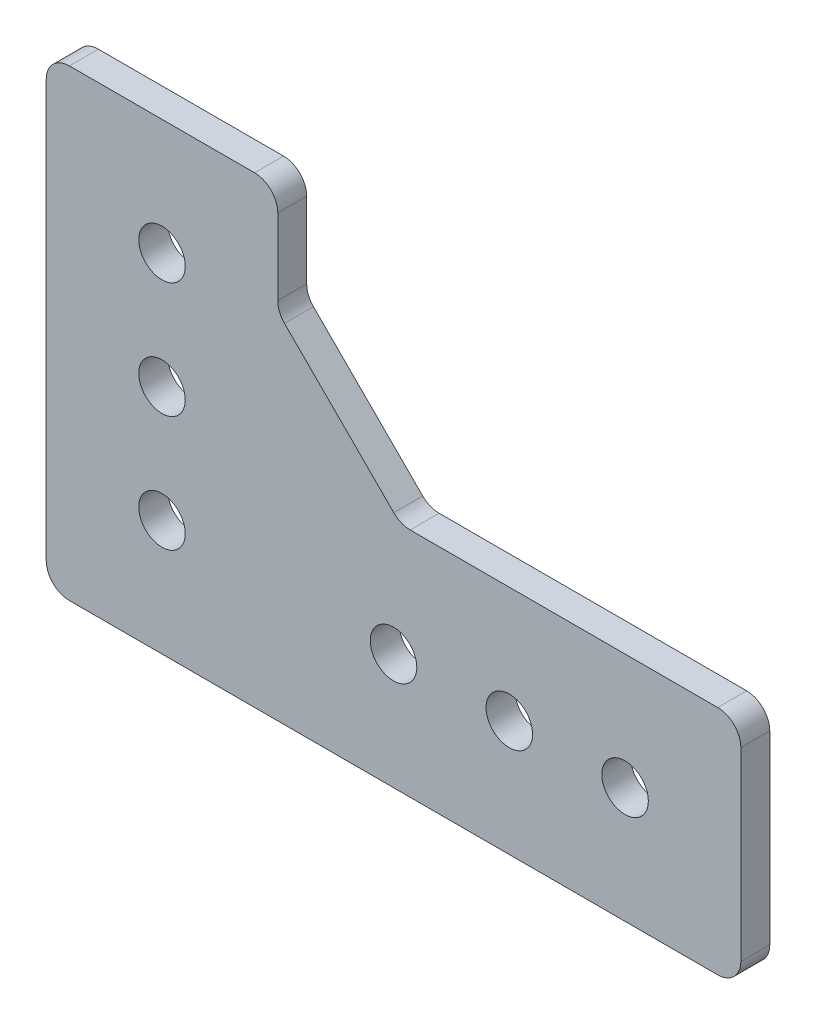
ISO-10303-21;
HEADER;
FILE_DESCRIPTION(('STEP AP214'),'2;1');
FILE_NAME('part.step','',(''),(''),'','','');
FILE_SCHEMA(('AUTOMOTIVE_DESIGN { 1 0 10303 214 1 1 1 1 }'));
ENDSEC;
DATA;
#1=APPLICATION_CONTEXT('core data for automotive mechanical design processes');
#2=APPLICATION_PROTOCOL_DEFINITION('international standard','automotive_design',2000,#1);
#3=PRODUCT_CONTEXT('',#1,'mechanical');
#4=PRODUCT('Part','Part','',(#3));
#5=PRODUCT_RELATED_PRODUCT_CATEGORY('part','',(#4));
#6=PRODUCT_DEFINITION_FORMATION('','',#4);
#7=PRODUCT_DEFINITION_CONTEXT('part definition',#1,'design');
#8=PRODUCT_DEFINITION('design','',#6,#7);
#9=PRODUCT_DEFINITION_SHAPE('','',#8);
#10=(LENGTH_UNIT() NAMED_UNIT(*) SI_UNIT(.MILLI.,.METRE.));
#11=(NAMED_UNIT(*) PLANE_ANGLE_UNIT() SI_UNIT($,.RADIAN.));
#12=(NAMED_UNIT(*) SI_UNIT($,.STERADIAN.) SOLID_ANGLE_UNIT());
#13=UNCERTAINTY_MEASURE_WITH_UNIT(LENGTH_MEASURE(1.E-05),#10,'distance_accuracy_value','');
#14=(GEOMETRIC_REPRESENTATION_CONTEXT(3) GLOBAL_UNCERTAINTY_ASSIGNED_CONTEXT((#13)) GLOBAL_UNIT_ASSIGNED_CONTEXT((#10,
#11,#12)) REPRESENTATION_CONTEXT('',''));
#15=CARTESIAN_POINT('',(0.,0.,0.));
#16=DIRECTION('',(0.,0.,1.));
#17=DIRECTION('',(1.,0.,0.));
#18=AXIS2_PLACEMENT_3D('',#15,#16,#17);
#19=CARTESIAN_POINT('',(0.,0.,0.));
#20=DIRECTION('',(0.,0.,1.));
#21=DIRECTION('',(1.,0.,0.));
#22=AXIS2_PLACEMENT_3D('',#19,#20,#21);
#23=PLANE('',#22);
#24=DIRECTION('',(0.,1.,0.));
#25=VECTOR('',#24,1.);
#26=CARTESIAN_POINT('',(0.,0.,0.));
#27=LINE('',#26,#25);
#28=CARTESIAN_POINT('',(0.,2.54,0.));
#29=VERTEX_POINT('',#28);
#30=CARTESIAN_POINT('',(0.,22.86,0.));
#31=VERTEX_POINT('',#30);
#32=EDGE_CURVE('E157',#29,#31,#27,.T.);
#33=ORIENTED_EDGE('',*,*,#32,.F.);
#34=CARTESIAN_POINT('',(-2.54,2.54,0.));
#35=DIRECTION('',(0.,0.,1.));
#36=DIRECTION('',(1.,0.,0.));
#37=AXIS2_PLACEMENT_3D('',#34,#35,#36);
#38=CIRCLE('',#37,2.54);
#39=CARTESIAN_POINT('',(-2.54,0.,0.));
#40=VERTEX_POINT('',#39);
#41=EDGE_CURVE('E140',#29,#40,#38,.F.);
#42=ORIENTED_EDGE('',*,*,#41,.T.);
#43=DIRECTION('',(-1.,0.,0.));
#44=VECTOR('',#43,1.);
#45=CARTESIAN_POINT('',(0.,0.,0.));
#46=LINE('',#45,#44);
#47=CARTESIAN_POINT('',(-73.66,0.,0.));
#48=VERTEX_POINT('',#47);
#49=EDGE_CURVE('E166',#40,#48,#46,.T.);
#50=ORIENTED_EDGE('',*,*,#49,.T.);
#51=CARTESIAN_POINT('',(-73.66,2.53999999999999,0.));
#52=DIRECTION('',(0.,0.,1.));
#53=DIRECTION('',(1.,0.,0.));
#54=AXIS2_PLACEMENT_3D('',#51,#52,#53);
#55=CIRCLE('',#54,2.54);
#56=CARTESIAN_POINT('',(-76.2,2.53999999999999,0.));
#57=VERTEX_POINT('',#56);
#58=EDGE_CURVE('E151',#48,#57,#55,.F.);
#59=ORIENTED_EDGE('',*,*,#58,.T.);
#60=DIRECTION('',(0.,1.,0.));
#61=VECTOR('',#60,1.);
#62=CARTESIAN_POINT('',(-76.2,0.,0.));
#63=LINE('',#62,#61);
#64=CARTESIAN_POINT('',(-76.2,48.26,0.));
#65=VERTEX_POINT('',#64);
#66=EDGE_CURVE('E170',#57,#65,#63,.T.);
#67=ORIENTED_EDGE('',*,*,#66,.T.);
#68=CARTESIAN_POINT('',(-73.66,48.26,0.));
#69=DIRECTION('',(0.,0.,1.));
#70=DIRECTION('',(1.,0.,0.));
#71=AXIS2_PLACEMENT_3D('',#68,#69,#70);
#72=CIRCLE('',#71,2.54);
#73=CARTESIAN_POINT('',(-73.66,50.8,0.));
#74=VERTEX_POINT('',#73);
#75=EDGE_CURVE('E179',#65,#74,#72,.F.);
#76=ORIENTED_EDGE('',*,*,#75,.T.);
#77=DIRECTION('',(1.,0.,0.));
#78=VECTOR('',#77,1.);
#79=CARTESIAN_POINT('',(0.,50.8,0.));
#80=LINE('',#79,#78);
#81=CARTESIAN_POINT('',(-53.34,50.8,0.));
#82=VERTEX_POINT('',#81);
#83=EDGE_CURVE('E262',#74,#82,#80,.T.);
#84=ORIENTED_EDGE('',*,*,#83,.T.);
#85=CARTESIAN_POINT('',(-53.34,48.26,0.));
#86=DIRECTION('',(0.,0.,1.));
#87=DIRECTION('',(1.,0.,0.));
#88=AXIS2_PLACEMENT_3D('',#85,#86,#87);
#89=CIRCLE('',#88,2.54);
#90=CARTESIAN_POINT('',(-50.8,48.26,0.));
#91=VERTEX_POINT('',#90);
#92=EDGE_CURVE('E177',#82,#91,#89,.F.);
#93=ORIENTED_EDGE('',*,*,#92,.T.);
#94=DIRECTION('',(0.,1.,0.));
#95=VECTOR('',#94,1.);
#96=CARTESIAN_POINT('',(-50.8,0.,0.));
#97=LINE('',#96,#95);
#98=CARTESIAN_POINT('',(-50.8,39.9224866300313,0.));
#99=VERTEX_POINT('',#98);
#100=EDGE_CURVE('E258',#99,#91,#97,.T.);
#101=ORIENTED_EDGE('',*,*,#100,.F.);
#102=CARTESIAN_POINT('',(-48.26,39.9224866300313,0.));
#103=DIRECTION('',(0.,0.,1.));
#104=DIRECTION('',(1.,0.,0.));
#105=AXIS2_PLACEMENT_3D('',#102,#103,#104);
#106=CIRCLE('',#105,2.54);
#107=CARTESIAN_POINT('',(-50.0560512242138,38.1264354058175,0.));
#108=VERTEX_POINT('',#107);
#109=EDGE_CURVE('E218',#99,#108,#106,.T.);
#110=ORIENTED_EDGE('',*,*,#109,.T.);
#111=DIRECTION('',(0.707106781186551,-0.707106781186544,0.));
#112=VECTOR('',#111,1.);
#113=CARTESIAN_POINT('',(-5.96480790919792,-5.96480790919798,0.));
#114=LINE('',#113,#112);
#115=CARTESIAN_POINT('',(-38.0735645941824,26.1439487757862,0.));
#116=VERTEX_POINT('',#115);
#117=EDGE_CURVE('E223',#108,#116,#114,.T.);
#118=ORIENTED_EDGE('',*,*,#117,.T.);
#119=CARTESIAN_POINT('',(-36.2775133699686,27.94,0.));
#120=DIRECTION('',(0.,0.,1.));
#121=DIRECTION('',(1.,0.,0.));
#122=AXIS2_PLACEMENT_3D('',#119,#120,#121);
#123=CIRCLE('',#122,2.54);
#124=CARTESIAN_POINT('',(-36.2775133699686,25.4,0.));
#125=VERTEX_POINT('',#124);
#126=EDGE_CURVE('E46',#116,#125,#123,.T.);
#127=ORIENTED_EDGE('',*,*,#126,.T.);
#128=DIRECTION('',(-1.,0.,0.));
#129=VECTOR('',#128,1.);
#130=CARTESIAN_POINT('',(0.,25.4,0.));
#131=LINE('',#130,#129);
#132=CARTESIAN_POINT('',(-2.54,25.4,0.));
#133=VERTEX_POINT('',#132);
#134=EDGE_CURVE('E165',#133,#125,#131,.T.);
#135=ORIENTED_EDGE('',*,*,#134,.F.);
#136=CARTESIAN_POINT('',(-2.54,22.86,0.));
#137=DIRECTION('',(0.,0.,1.));
#138=DIRECTION('',(1.,0.,0.));
#139=AXIS2_PLACEMENT_3D('',#136,#137,#138);
#140=CIRCLE('',#139,2.54);
#141=EDGE_CURVE('E160',#133,#31,#140,.F.);
#142=ORIENTED_EDGE('',*,*,#141,.T.);
#143=EDGE_LOOP('',(#33,#42,#50,#59,#67,#76,#84,#93,#101,#110,#118,#127,#135,#142));
#144=FACE_BOUND('',#143,.T.);
#145=CARTESIAN_POINT('',(-12.7,12.7,0.));
#146=DIRECTION('',(0.,0.,1.));
#147=DIRECTION('',(1.,0.,0.));
#148=AXIS2_PLACEMENT_3D('',#145,#146,#147);
#149=CIRCLE('',#148,2.55269999999999);
#150=CARTESIAN_POINT('',(-10.1473,12.7,0.));
#151=VERTEX_POINT('',#150);
#152=EDGE_CURVE('E259',#151,#151,#149,.F.);
#153=ORIENTED_EDGE('',*,*,#152,.F.);
#154=EDGE_LOOP('',(#153));
#155=FACE_BOUND('',#154,.T.);
#156=CARTESIAN_POINT('',(-25.4,12.7,0.));
#157=DIRECTION('',(0.,0.,1.));
#158=DIRECTION('',(1.,0.,0.));
#159=AXIS2_PLACEMENT_3D('',#156,#157,#158);
#160=CIRCLE('',#159,2.55269999999999);
#161=CARTESIAN_POINT('',(-22.8473,12.7,0.));
#162=VERTEX_POINT('',#161);
#163=EDGE_CURVE('E331',#162,#162,#160,.F.);
#164=ORIENTED_EDGE('',*,*,#163,.F.);
#165=EDGE_LOOP('',(#164));
#166=FACE_BOUND('',#165,.T.);
#167=CARTESIAN_POINT('',(-38.1,12.7,0.));
#168=DIRECTION('',(0.,0.,1.));
#169=DIRECTION('',(1.,0.,0.));
#170=AXIS2_PLACEMENT_3D('',#167,#168,#169);
#171=CIRCLE('',#170,2.55269999999999);
#172=CARTESIAN_POINT('',(-35.5473,12.7,0.));
#173=VERTEX_POINT('',#172);
#174=EDGE_CURVE('E337',#173,#173,#171,.F.);
#175=ORIENTED_EDGE('',*,*,#174,.F.);
#176=EDGE_LOOP('',(#175));
#177=FACE_BOUND('',#176,.T.);
#178=CARTESIAN_POINT('',(-63.5,12.7,0.));
#179=DIRECTION('',(0.,0.,1.));
#180=DIRECTION('',(1.,0.,0.));
#181=AXIS2_PLACEMENT_3D('',#178,#179,#180);
#182=CIRCLE('',#181,2.55269999999999);
#183=CARTESIAN_POINT('',(-60.9473,12.7,0.));
#184=VERTEX_POINT('',#183);
#185=EDGE_CURVE('E341',#184,#184,#182,.F.);
#186=ORIENTED_EDGE('',*,*,#185,.F.);
#187=EDGE_LOOP('',(#186));
#188=FACE_BOUND('',#187,.T.);
#189=CARTESIAN_POINT('',(-63.5,25.4,0.));
#190=DIRECTION('',(0.,0.,1.));
#191=DIRECTION('',(1.,0.,0.));
#192=AXIS2_PLACEMENT_3D('',#189,#190,#191);
#193=CIRCLE('',#192,2.55269999999999);
#194=CARTESIAN_POINT('',(-60.9473,25.4,0.));
#195=VERTEX_POINT('',#194);
#196=EDGE_CURVE('E345',#195,#195,#193,.F.);
#197=ORIENTED_EDGE('',*,*,#196,.F.);
#198=EDGE_LOOP('',(#197));
#199=FACE_BOUND('',#198,.T.);
#200=CARTESIAN_POINT('',(-63.5,38.1,0.));
#201=DIRECTION('',(0.,0.,1.));
#202=DIRECTION('',(1.,0.,0.));
#203=AXIS2_PLACEMENT_3D('',#200,#201,#202);
#204=CIRCLE('',#203,2.55269999999999);
#205=CARTESIAN_POINT('',(-60.9473,38.1,0.));
#206=VERTEX_POINT('',#205);
#207=EDGE_CURVE('E349',#206,#206,#204,.F.);
#208=ORIENTED_EDGE('',*,*,#207,.F.);
#209=EDGE_LOOP('',(#208));
#210=FACE_BOUND('',#209,.T.);
#211=ADVANCED_FACE('F38',(#144,#155,#166,#177,#188,#199,#210),#23,.F.);
#212=CARTESIAN_POINT('',(-5.96480790919792,-5.96480790919798,3.175));
#213=DIRECTION('',(0.707106781186544,0.707106781186551,0.));
#214=DIRECTION('',(-0.707106781186551,0.707106781186544,0.));
#215=AXIS2_PLACEMENT_3D('',#212,#213,#214);
#216=PLANE('',#215);
#217=ORIENTED_EDGE('',*,*,#117,.F.);
#218=DIRECTION('',(0.,0.,-1.));
#219=VECTOR('',#218,1.);
#220=CARTESIAN_POINT('',(-50.0560512242138,38.1264354058175,3.175));
#221=LINE('',#220,#219);
#222=CARTESIAN_POINT('',(-50.0560512242138,38.1264354058175,3.175));
#223=VERTEX_POINT('',#222);
#224=EDGE_CURVE('E212',#108,#223,#221,.F.);
#225=ORIENTED_EDGE('',*,*,#224,.T.);
#226=DIRECTION('',(0.707106781186551,-0.707106781186544,0.));
#227=VECTOR('',#226,1.);
#228=CARTESIAN_POINT('',(-5.96480790919792,-5.96480790919798,3.175));
#229=LINE('',#228,#227);
#230=CARTESIAN_POINT('',(-38.0735645941824,26.1439487757862,3.175));
#231=VERTEX_POINT('',#230);
#232=EDGE_CURVE('E168',#223,#231,#229,.T.);
#233=ORIENTED_EDGE('',*,*,#232,.T.);
#234=DIRECTION('',(0.,0.,-1.));
#235=VECTOR('',#234,1.);
#236=CARTESIAN_POINT('',(-38.0735645941824,26.1439487757862,3.175));
#237=LINE('',#236,#235);
#238=EDGE_CURVE('E209',#231,#116,#237,.T.);
#239=ORIENTED_EDGE('',*,*,#238,.T.);
#240=EDGE_LOOP('',(#217,#225,#233,#239));
#241=FACE_BOUND('',#240,.T.);
#242=ADVANCED_FACE('F236',(#241),#216,.T.);
#243=CARTESIAN_POINT('',(-50.8,0.,3.175));
#244=DIRECTION('',(-1.,0.,0.));
#245=DIRECTION('',(0.,-1.,0.));
#246=AXIS2_PLACEMENT_3D('',#243,#244,#245);
#247=PLANE('',#246);
#248=ORIENTED_EDGE('',*,*,#100,.T.);
#249=DIRECTION('',(0.,0.,-1.));
#250=VECTOR('',#249,1.);
#251=CARTESIAN_POINT('',(-50.8,48.26,3.175));
#252=LINE('',#251,#250);
#253=CARTESIAN_POINT('',(-50.8,48.26,3.175));
#254=VERTEX_POINT('',#253);
#255=EDGE_CURVE('E207',#91,#254,#252,.F.);
#256=ORIENTED_EDGE('',*,*,#255,.T.);
#257=DIRECTION('',(0.,1.,0.));
#258=VECTOR('',#257,1.);
#259=CARTESIAN_POINT('',(-50.8,0.,3.175));
#260=LINE('',#259,#258);
#261=CARTESIAN_POINT('',(-50.8,39.9224866300313,3.175));
#262=VERTEX_POINT('',#261);
#263=EDGE_CURVE('E238',#262,#254,#260,.T.);
#264=ORIENTED_EDGE('',*,*,#263,.F.);
#265=DIRECTION('',(0.,0.,-1.));
#266=VECTOR('',#265,1.);
#267=CARTESIAN_POINT('',(-50.8,39.9224866300313,3.175));
#268=LINE('',#267,#266);
#269=EDGE_CURVE('E204',#262,#99,#268,.T.);
#270=ORIENTED_EDGE('',*,*,#269,.T.);
#271=EDGE_LOOP('',(#248,#256,#264,#270));
#272=FACE_BOUND('',#271,.T.);
#273=ADVANCED_FACE('F292',(#272),#247,.F.);
#274=CARTESIAN_POINT('',(0.,50.8,3.175));
#275=DIRECTION('',(0.,1.,0.));
#276=DIRECTION('',(0.,0.,1.));
#277=AXIS2_PLACEMENT_3D('',#274,#275,#276);
#278=PLANE('',#277);
#279=ORIENTED_EDGE('',*,*,#83,.F.);
#280=DIRECTION('',(0.,0.,-1.));
#281=VECTOR('',#280,1.);
#282=CARTESIAN_POINT('',(-73.66,50.8,3.175));
#283=LINE('',#282,#281);
#284=CARTESIAN_POINT('',(-73.66,50.8,3.175));
#285=VERTEX_POINT('',#284);
#286=EDGE_CURVE('E202',#74,#285,#283,.F.);
#287=ORIENTED_EDGE('',*,*,#286,.T.);
#288=DIRECTION('',(1.,0.,0.));
#289=VECTOR('',#288,1.);
#290=CARTESIAN_POINT('',(0.,50.8,3.175));
#291=LINE('',#290,#289);
#292=CARTESIAN_POINT('',(-53.34,50.8,3.175));
#293=VERTEX_POINT('',#292);
#294=EDGE_CURVE('E241',#285,#293,#291,.T.);
#295=ORIENTED_EDGE('',*,*,#294,.T.);
#296=DIRECTION('',(0.,0.,-1.));
#297=VECTOR('',#296,1.);
#298=CARTESIAN_POINT('',(-53.34,50.8,0.));
#299=LINE('',#298,#297);
#300=EDGE_CURVE('E199',#293,#82,#299,.T.);
#301=ORIENTED_EDGE('',*,*,#300,.T.);
#302=EDGE_LOOP('',(#279,#287,#295,#301));
#303=FACE_BOUND('',#302,.T.);
#304=ADVANCED_FACE('F285',(#303),#278,.T.);
#305=CARTESIAN_POINT('',(-76.2,0.,3.175));
#306=DIRECTION('',(-1.,0.,0.));
#307=DIRECTION('',(0.,0.,1.));
#308=AXIS2_PLACEMENT_3D('',#305,#306,#307);
#309=PLANE('',#308);
#310=ORIENTED_EDGE('',*,*,#66,.F.);
#311=DIRECTION('',(0.,0.,-1.));
#312=VECTOR('',#311,1.);
#313=CARTESIAN_POINT('',(-76.2,2.53999999999999,3.175));
#314=LINE('',#313,#312);
#315=CARTESIAN_POINT('',(-76.2,2.53999999999999,3.175));
#316=VERTEX_POINT('',#315);
#317=EDGE_CURVE('E197',#57,#316,#314,.F.);
#318=ORIENTED_EDGE('',*,*,#317,.T.);
#319=DIRECTION('',(0.,1.,0.));
#320=VECTOR('',#319,1.);
#321=CARTESIAN_POINT('',(-76.2,0.,3.175));
#322=LINE('',#321,#320);
#323=CARTESIAN_POINT('',(-76.2,48.26,3.175));
#324=VERTEX_POINT('',#323);
#325=EDGE_CURVE('E249',#316,#324,#322,.T.);
#326=ORIENTED_EDGE('',*,*,#325,.T.);
#327=DIRECTION('',(0.,0.,-1.));
#328=VECTOR('',#327,1.);
#329=CARTESIAN_POINT('',(-76.2,48.26,3.175));
#330=LINE('',#329,#328);
#331=EDGE_CURVE('E194',#324,#65,#330,.T.);
#332=ORIENTED_EDGE('',*,*,#331,.T.);
#333=EDGE_LOOP('',(#310,#318,#326,#332));
#334=FACE_BOUND('',#333,.T.);
#335=ADVANCED_FACE('F269',(#334),#309,.T.);
#336=CARTESIAN_POINT('',(0.,0.,3.175));
#337=DIRECTION('',(0.,-1.,0.));
#338=DIRECTION('',(1.,0.,0.));
#339=AXIS2_PLACEMENT_3D('',#336,#337,#338);
#340=PLANE('',#339);
#341=ORIENTED_EDGE('',*,*,#49,.F.);
#342=DIRECTION('',(0.,0.,-1.));
#343=VECTOR('',#342,1.);
#344=CARTESIAN_POINT('',(-2.54,0.,3.175));
#345=LINE('',#344,#343);
#346=CARTESIAN_POINT('',(-2.54,0.,3.175));
#347=VERTEX_POINT('',#346);
#348=EDGE_CURVE('E145',#40,#347,#345,.F.);
#349=ORIENTED_EDGE('',*,*,#348,.T.);
#350=DIRECTION('',(-1.,0.,0.));
#351=VECTOR('',#350,1.);
#352=CARTESIAN_POINT('',(0.,0.,3.175));
#353=LINE('',#352,#351);
#354=CARTESIAN_POINT('',(-73.66,0.,3.175));
#355=VERTEX_POINT('',#354);
#356=EDGE_CURVE('E252',#347,#355,#353,.T.);
#357=ORIENTED_EDGE('',*,*,#356,.T.);
#358=DIRECTION('',(0.,0.,-1.));
#359=VECTOR('',#358,1.);
#360=CARTESIAN_POINT('',(-73.66,0.,3.175));
#361=LINE('',#360,#359);
#362=EDGE_CURVE('E150',#355,#48,#361,.T.);
#363=ORIENTED_EDGE('',*,*,#362,.T.);
#364=EDGE_LOOP('',(#341,#349,#357,#363));
#365=FACE_BOUND('',#364,.T.);
#366=ADVANCED_FACE('F277',(#365),#340,.T.);
#367=CARTESIAN_POINT('',(0.,0.,3.175));
#368=DIRECTION('',(-1.,0.,0.));
#369=DIRECTION('',(0.,0.,1.));
#370=AXIS2_PLACEMENT_3D('',#367,#368,#369);
#371=PLANE('',#370);
#372=DIRECTION('',(0.,1.,0.));
#373=VECTOR('',#372,1.);
#374=CARTESIAN_POINT('',(0.,0.,3.175));
#375=LINE('',#374,#373);
#376=CARTESIAN_POINT('',(0.,2.54,3.175));
#377=VERTEX_POINT('',#376);
#378=CARTESIAN_POINT('',(0.,22.86,3.175));
#379=VERTEX_POINT('',#378);
#380=EDGE_CURVE('E159',#377,#379,#375,.T.);
#381=ORIENTED_EDGE('',*,*,#380,.F.);
#382=DIRECTION('',(0.,0.,-1.));
#383=VECTOR('',#382,1.);
#384=CARTESIAN_POINT('',(0.,2.54,0.));
#385=LINE('',#384,#383);
#386=EDGE_CURVE('E144',#377,#29,#385,.T.);
#387=ORIENTED_EDGE('',*,*,#386,.T.);
#388=ORIENTED_EDGE('',*,*,#32,.T.);
#389=DIRECTION('',(0.,0.,-1.));
#390=VECTOR('',#389,1.);
#391=CARTESIAN_POINT('',(0.,22.86,3.175));
#392=LINE('',#391,#390);
#393=EDGE_CURVE('E161',#31,#379,#392,.F.);
#394=ORIENTED_EDGE('',*,*,#393,.T.);
#395=EDGE_LOOP('',(#381,#387,#388,#394));
#396=FACE_BOUND('',#395,.T.);
#397=ADVANCED_FACE('F156',(#396),#371,.F.);
#398=CARTESIAN_POINT('',(0.,25.4,3.175));
#399=DIRECTION('',(0.,-1.,0.));
#400=DIRECTION('',(1.,0.,0.));
#401=AXIS2_PLACEMENT_3D('',#398,#399,#400);
#402=PLANE('',#401);
#403=ORIENTED_EDGE('',*,*,#134,.T.);
#404=DIRECTION('',(0.,0.,-1.));
#405=VECTOR('',#404,1.);
#406=CARTESIAN_POINT('',(-36.2775133699686,25.4,3.175));
#407=LINE('',#406,#405);
#408=CARTESIAN_POINT('',(-36.2775133699686,25.4,3.175));
#409=VERTEX_POINT('',#408);
#410=EDGE_CURVE('E53',#125,#409,#407,.F.);
#411=ORIENTED_EDGE('',*,*,#410,.T.);
#412=DIRECTION('',(-1.,0.,0.));
#413=VECTOR('',#412,1.);
#414=CARTESIAN_POINT('',(0.,25.4,3.175));
#415=LINE('',#414,#413);
#416=CARTESIAN_POINT('',(-2.54,25.4,3.175));
#417=VERTEX_POINT('',#416);
#418=EDGE_CURVE('E174',#417,#409,#415,.T.);
#419=ORIENTED_EDGE('',*,*,#418,.F.);
#420=DIRECTION('',(0.,0.,-1.));
#421=VECTOR('',#420,1.);
#422=CARTESIAN_POINT('',(-2.54,25.4,3.175));
#423=LINE('',#422,#421);
#424=EDGE_CURVE('E214',#417,#133,#423,.T.);
#425=ORIENTED_EDGE('',*,*,#424,.T.);
#426=EDGE_LOOP('',(#403,#411,#419,#425));
#427=FACE_BOUND('',#426,.T.);
#428=ADVANCED_FACE('F226',(#427),#402,.F.);
#429=CARTESIAN_POINT('',(0.,0.,3.175));
#430=DIRECTION('',(0.,0.,1.));
#431=DIRECTION('',(1.,0.,0.));
#432=AXIS2_PLACEMENT_3D('',#429,#430,#431);
#433=PLANE('',#432);
#434=CARTESIAN_POINT('',(-63.5,38.1,3.175));
#435=DIRECTION('',(0.,0.,1.));
#436=DIRECTION('',(1.,0.,0.));
#437=AXIS2_PLACEMENT_3D('',#434,#435,#436);
#438=CIRCLE('',#437,2.55269999999999);
#439=CARTESIAN_POINT('',(-60.9473,38.1,3.175));
#440=VERTEX_POINT('',#439);
#441=EDGE_CURVE('E311',#440,#440,#438,.T.);
#442=ORIENTED_EDGE('',*,*,#441,.F.);
#443=EDGE_LOOP('',(#442));
#444=FACE_BOUND('',#443,.T.);
#445=CARTESIAN_POINT('',(-63.5,25.4,3.175));
#446=DIRECTION('',(0.,0.,1.));
#447=DIRECTION('',(1.,0.,0.));
#448=AXIS2_PLACEMENT_3D('',#445,#446,#447);
#449=CIRCLE('',#448,2.55269999999999);
#450=CARTESIAN_POINT('',(-60.9473,25.4,3.175));
#451=VERTEX_POINT('',#450);
#452=EDGE_CURVE('E315',#451,#451,#449,.T.);
#453=ORIENTED_EDGE('',*,*,#452,.F.);
#454=EDGE_LOOP('',(#453));
#455=FACE_BOUND('',#454,.T.);
#456=CARTESIAN_POINT('',(-63.5,12.7,3.175));
#457=DIRECTION('',(0.,0.,1.));
#458=DIRECTION('',(1.,0.,0.));
#459=AXIS2_PLACEMENT_3D('',#456,#457,#458);
#460=CIRCLE('',#459,2.55269999999999);
#461=CARTESIAN_POINT('',(-60.9473,12.7,3.175));
#462=VERTEX_POINT('',#461);
#463=EDGE_CURVE('E319',#462,#462,#460,.T.);
#464=ORIENTED_EDGE('',*,*,#463,.F.);
#465=EDGE_LOOP('',(#464));
#466=FACE_BOUND('',#465,.T.);
#467=CARTESIAN_POINT('',(-38.1,12.7,3.175));
#468=DIRECTION('',(0.,0.,1.));
#469=DIRECTION('',(1.,0.,0.));
#470=AXIS2_PLACEMENT_3D('',#467,#468,#469);
#471=CIRCLE('',#470,2.55269999999999);
#472=CARTESIAN_POINT('',(-35.5473,12.7,3.175));
#473=VERTEX_POINT('',#472);
#474=EDGE_CURVE('E323',#473,#473,#471,.T.);
#475=ORIENTED_EDGE('',*,*,#474,.F.);
#476=EDGE_LOOP('',(#475));
#477=FACE_BOUND('',#476,.T.);
#478=CARTESIAN_POINT('',(-25.4,12.7,3.175));
#479=DIRECTION('',(0.,0.,1.));
#480=DIRECTION('',(1.,0.,0.));
#481=AXIS2_PLACEMENT_3D('',#478,#479,#480);
#482=CIRCLE('',#481,2.55269999999999);
#483=CARTESIAN_POINT('',(-22.8473,12.7,3.175));
#484=VERTEX_POINT('',#483);
#485=EDGE_CURVE('E327',#484,#484,#482,.T.);
#486=ORIENTED_EDGE('',*,*,#485,.F.);
#487=EDGE_LOOP('',(#486));
#488=FACE_BOUND('',#487,.T.);
#489=CARTESIAN_POINT('',(-12.7,12.7,3.175));
#490=DIRECTION('',(0.,0.,1.));
#491=DIRECTION('',(1.,0.,0.));
#492=AXIS2_PLACEMENT_3D('',#489,#490,#491);
#493=CIRCLE('',#492,2.55269999999999);
#494=CARTESIAN_POINT('',(-10.1473,12.7,3.175));
#495=VERTEX_POINT('',#494);
#496=EDGE_CURVE('E244',#495,#495,#493,.T.);
#497=ORIENTED_EDGE('',*,*,#496,.F.);
#498=EDGE_LOOP('',(#497));
#499=FACE_BOUND('',#498,.T.);
#500=ORIENTED_EDGE('',*,*,#356,.F.);
#501=CARTESIAN_POINT('',(-2.54,2.54,3.175));
#502=DIRECTION('',(0.,0.,1.));
#503=DIRECTION('',(1.,0.,0.));
#504=AXIS2_PLACEMENT_3D('',#501,#502,#503);
#505=CIRCLE('',#504,2.54);
#506=EDGE_CURVE('E192',#347,#377,#505,.T.);
#507=ORIENTED_EDGE('',*,*,#506,.T.);
#508=ORIENTED_EDGE('',*,*,#380,.T.);
#509=CARTESIAN_POINT('',(-2.54,22.86,3.175));
#510=DIRECTION('',(0.,0.,1.));
#511=DIRECTION('',(1.,0.,0.));
#512=AXIS2_PLACEMENT_3D('',#509,#510,#511);
#513=CIRCLE('',#512,2.54);
#514=EDGE_CURVE('E60',#379,#417,#513,.T.);
#515=ORIENTED_EDGE('',*,*,#514,.T.);
#516=ORIENTED_EDGE('',*,*,#418,.T.);
#517=CARTESIAN_POINT('',(-36.2775133699686,27.94,3.175));
#518=DIRECTION('',(0.,0.,1.));
#519=DIRECTION('',(1.,0.,0.));
#520=AXIS2_PLACEMENT_3D('',#517,#518,#519);
#521=CIRCLE('',#520,2.54);
#522=EDGE_CURVE('E11',#409,#231,#521,.F.);
#523=ORIENTED_EDGE('',*,*,#522,.T.);
#524=ORIENTED_EDGE('',*,*,#232,.F.);
#525=CARTESIAN_POINT('',(-48.26,39.9224866300313,3.175));
#526=DIRECTION('',(0.,0.,1.));
#527=DIRECTION('',(1.,0.,0.));
#528=AXIS2_PLACEMENT_3D('',#525,#526,#527);
#529=CIRCLE('',#528,2.54);
#530=EDGE_CURVE('E220',#223,#262,#529,.F.);
#531=ORIENTED_EDGE('',*,*,#530,.T.);
#532=ORIENTED_EDGE('',*,*,#263,.T.);
#533=CARTESIAN_POINT('',(-53.34,48.26,3.175));
#534=DIRECTION('',(0.,0.,1.));
#535=DIRECTION('',(1.,0.,0.));
#536=AXIS2_PLACEMENT_3D('',#533,#534,#535);
#537=CIRCLE('',#536,2.54);
#538=EDGE_CURVE('E186',#254,#293,#537,.T.);
#539=ORIENTED_EDGE('',*,*,#538,.T.);
#540=ORIENTED_EDGE('',*,*,#294,.F.);
#541=CARTESIAN_POINT('',(-73.66,48.26,3.175));
#542=DIRECTION('',(0.,0.,1.));
#543=DIRECTION('',(1.,0.,0.));
#544=AXIS2_PLACEMENT_3D('',#541,#542,#543);
#545=CIRCLE('',#544,2.54);
#546=EDGE_CURVE('E188',#285,#324,#545,.T.);
#547=ORIENTED_EDGE('',*,*,#546,.T.);
#548=ORIENTED_EDGE('',*,*,#325,.F.);
#549=CARTESIAN_POINT('',(-73.66,2.53999999999999,3.175));
#550=DIRECTION('',(0.,0.,1.));
#551=DIRECTION('',(1.,0.,0.));
#552=AXIS2_PLACEMENT_3D('',#549,#550,#551);
#553=CIRCLE('',#552,2.54);
#554=EDGE_CURVE('E190',#316,#355,#553,.T.);
#555=ORIENTED_EDGE('',*,*,#554,.T.);
#556=EDGE_LOOP('',(#500,#507,#508,#515,#516,#523,#524,#531,#532,#539,#540,#547,#548,#555));
#557=FACE_BOUND('',#556,.T.);
#558=ADVANCED_FACE('F233',(#444,#455,#466,#477,#488,#499,#557),#433,.T.);
#559=CARTESIAN_POINT('',(-12.7,12.7,3.175));
#560=DIRECTION('',(0.,0.,1.));
#561=DIRECTION('',(1.,0.,0.));
#562=AXIS2_PLACEMENT_3D('',#559,#560,#561);
#563=CYLINDRICAL_SURFACE('',#562,2.55269999999999);
#564=ORIENTED_EDGE('',*,*,#152,.T.);
#565=EDGE_LOOP('',(#564));
#566=FACE_BOUND('',#565,.T.);
#567=ORIENTED_EDGE('',*,*,#496,.T.);
#568=EDGE_LOOP('',(#567));
#569=FACE_BOUND('',#568,.T.);
#570=ADVANCED_FACE('F301',(#566,#569),#563,.F.);
#571=CARTESIAN_POINT('',(-25.4,12.7,3.175));
#572=DIRECTION('',(0.,0.,1.));
#573=DIRECTION('',(1.,0.,0.));
#574=AXIS2_PLACEMENT_3D('',#571,#572,#573);
#575=CYLINDRICAL_SURFACE('',#574,2.55269999999999);
#576=ORIENTED_EDGE('',*,*,#163,.T.);
#577=EDGE_LOOP('',(#576));
#578=FACE_BOUND('',#577,.T.);
#579=ORIENTED_EDGE('',*,*,#485,.T.);
#580=EDGE_LOOP('',(#579));
#581=FACE_BOUND('',#580,.T.);
#582=ADVANCED_FACE('F306',(#578,#581),#575,.F.);
#583=CARTESIAN_POINT('',(-38.1,12.7,3.175));
#584=DIRECTION('',(0.,0.,1.));
#585=DIRECTION('',(1.,0.,0.));
#586=AXIS2_PLACEMENT_3D('',#583,#584,#585);
#587=CYLINDRICAL_SURFACE('',#586,2.55269999999999);
#588=ORIENTED_EDGE('',*,*,#174,.T.);
#589=EDGE_LOOP('',(#588));
#590=FACE_BOUND('',#589,.T.);
#591=ORIENTED_EDGE('',*,*,#474,.T.);
#592=EDGE_LOOP('',(#591));
#593=FACE_BOUND('',#592,.T.);
#594=ADVANCED_FACE('F373',(#590,#593),#587,.F.);
#595=CARTESIAN_POINT('',(-63.5,12.7,3.175));
#596=DIRECTION('',(0.,0.,1.));
#597=DIRECTION('',(1.,0.,0.));
#598=AXIS2_PLACEMENT_3D('',#595,#596,#597);
#599=CYLINDRICAL_SURFACE('',#598,2.55269999999999);
#600=ORIENTED_EDGE('',*,*,#185,.T.);
#601=EDGE_LOOP('',(#600));
#602=FACE_BOUND('',#601,.T.);
#603=ORIENTED_EDGE('',*,*,#463,.T.);
#604=EDGE_LOOP('',(#603));
#605=FACE_BOUND('',#604,.T.);
#606=ADVANCED_FACE('F367',(#602,#605),#599,.F.);
#607=CARTESIAN_POINT('',(-63.5,25.4,3.175));
#608=DIRECTION('',(0.,0.,1.));
#609=DIRECTION('',(1.,0.,0.));
#610=AXIS2_PLACEMENT_3D('',#607,#608,#609);
#611=CYLINDRICAL_SURFACE('',#610,2.55269999999999);
#612=ORIENTED_EDGE('',*,*,#196,.T.);
#613=EDGE_LOOP('',(#612));
#614=FACE_BOUND('',#613,.T.);
#615=ORIENTED_EDGE('',*,*,#452,.T.);
#616=EDGE_LOOP('',(#615));
#617=FACE_BOUND('',#616,.T.);
#618=ADVANCED_FACE('F360',(#614,#617),#611,.F.);
#619=CARTESIAN_POINT('',(-63.5,38.1,3.175));
#620=DIRECTION('',(0.,0.,1.));
#621=DIRECTION('',(1.,0.,0.));
#622=AXIS2_PLACEMENT_3D('',#619,#620,#621);
#623=CYLINDRICAL_SURFACE('',#622,2.55269999999999);
#624=ORIENTED_EDGE('',*,*,#207,.T.);
#625=EDGE_LOOP('',(#624));
#626=FACE_BOUND('',#625,.T.);
#627=ORIENTED_EDGE('',*,*,#441,.T.);
#628=EDGE_LOOP('',(#627));
#629=FACE_BOUND('',#628,.T.);
#630=ADVANCED_FACE('F356',(#626,#629),#623,.F.);
#631=CARTESIAN_POINT('',(-2.54,2.54,3.175));
#632=DIRECTION('',(0.,0.,1.));
#633=DIRECTION('',(1.,0.,0.));
#634=AXIS2_PLACEMENT_3D('',#631,#632,#633);
#635=CYLINDRICAL_SURFACE('',#634,2.54);
#636=ORIENTED_EDGE('',*,*,#506,.F.);
#637=ORIENTED_EDGE('',*,*,#348,.F.);
#638=ORIENTED_EDGE('',*,*,#41,.F.);
#639=ORIENTED_EDGE('',*,*,#386,.F.);
#640=EDGE_LOOP('',(#636,#637,#638,#639));
#641=FACE_BOUND('',#640,.T.);
#642=ADVANCED_FACE('F143',(#641),#635,.T.);
#643=CARTESIAN_POINT('',(-73.66,2.53999999999999,3.175));
#644=DIRECTION('',(0.,0.,-1.));
#645=DIRECTION('',(-1.,0.,0.));
#646=AXIS2_PLACEMENT_3D('',#643,#644,#645);
#647=CYLINDRICAL_SURFACE('',#646,2.54);
#648=ORIENTED_EDGE('',*,*,#554,.F.);
#649=ORIENTED_EDGE('',*,*,#317,.F.);
#650=ORIENTED_EDGE('',*,*,#58,.F.);
#651=ORIENTED_EDGE('',*,*,#362,.F.);
#652=EDGE_LOOP('',(#648,#649,#650,#651));
#653=FACE_BOUND('',#652,.T.);
#654=ADVANCED_FACE('F274',(#653),#647,.T.);
#655=CARTESIAN_POINT('',(-73.66,48.26,3.175));
#656=DIRECTION('',(0.,0.,-1.));
#657=DIRECTION('',(-1.,0.,0.));
#658=AXIS2_PLACEMENT_3D('',#655,#656,#657);
#659=CYLINDRICAL_SURFACE('',#658,2.54);
#660=ORIENTED_EDGE('',*,*,#546,.F.);
#661=ORIENTED_EDGE('',*,*,#286,.F.);
#662=ORIENTED_EDGE('',*,*,#75,.F.);
#663=ORIENTED_EDGE('',*,*,#331,.F.);
#664=EDGE_LOOP('',(#660,#661,#662,#663));
#665=FACE_BOUND('',#664,.T.);
#666=ADVANCED_FACE('F468',(#665),#659,.T.);
#667=CARTESIAN_POINT('',(-53.34,48.26,3.175));
#668=DIRECTION('',(0.,0.,1.));
#669=DIRECTION('',(1.,0.,0.));
#670=AXIS2_PLACEMENT_3D('',#667,#668,#669);
#671=CYLINDRICAL_SURFACE('',#670,2.54);
#672=ORIENTED_EDGE('',*,*,#538,.F.);
#673=ORIENTED_EDGE('',*,*,#255,.F.);
#674=ORIENTED_EDGE('',*,*,#92,.F.);
#675=ORIENTED_EDGE('',*,*,#300,.F.);
#676=EDGE_LOOP('',(#672,#673,#674,#675));
#677=FACE_BOUND('',#676,.T.);
#678=ADVANCED_FACE('F477',(#677),#671,.T.);
#679=CARTESIAN_POINT('',(-48.26,39.9224866300313,3.175));
#680=DIRECTION('',(0.,0.,-1.));
#681=DIRECTION('',(-1.,0.,0.));
#682=AXIS2_PLACEMENT_3D('',#679,#680,#681);
#683=CYLINDRICAL_SURFACE('',#682,2.54);
#684=ORIENTED_EDGE('',*,*,#530,.F.);
#685=ORIENTED_EDGE('',*,*,#224,.F.);
#686=ORIENTED_EDGE('',*,*,#109,.F.);
#687=ORIENTED_EDGE('',*,*,#269,.F.);
#688=EDGE_LOOP('',(#684,#685,#686,#687));
#689=FACE_BOUND('',#688,.T.);
#690=ADVANCED_FACE('F487',(#689),#683,.F.);
#691=CARTESIAN_POINT('',(-36.2775133699686,27.94,3.175));
#692=DIRECTION('',(0.,0.,-1.));
#693=DIRECTION('',(-1.,0.,0.));
#694=AXIS2_PLACEMENT_3D('',#691,#692,#693);
#695=CYLINDRICAL_SURFACE('',#694,2.54);
#696=ORIENTED_EDGE('',*,*,#522,.F.);
#697=ORIENTED_EDGE('',*,*,#410,.F.);
#698=ORIENTED_EDGE('',*,*,#126,.F.);
#699=ORIENTED_EDGE('',*,*,#238,.F.);
#700=EDGE_LOOP('',(#696,#697,#698,#699));
#701=FACE_BOUND('',#700,.T.);
#702=ADVANCED_FACE('F229',(#701),#695,.F.);
#703=CARTESIAN_POINT('',(-2.54,22.86,3.175));
#704=DIRECTION('',(0.,0.,-1.));
#705=DIRECTION('',(-1.,0.,0.));
#706=AXIS2_PLACEMENT_3D('',#703,#704,#705);
#707=CYLINDRICAL_SURFACE('',#706,2.54);
#708=ORIENTED_EDGE('',*,*,#514,.F.);
#709=ORIENTED_EDGE('',*,*,#393,.F.);
#710=ORIENTED_EDGE('',*,*,#141,.F.);
#711=ORIENTED_EDGE('',*,*,#424,.F.);
#712=EDGE_LOOP('',(#708,#709,#710,#711));
#713=FACE_BOUND('',#712,.T.);
#714=ADVANCED_FACE('F40',(#713),#707,.T.);
#715=CLOSED_SHELL('',(#211,#242,#273,#304,#335,#366,#397,#428,#558,#570,#582,#594,#606,#618,
#630,#642,#654,#666,#678,#690,#702,#714));
#716=MANIFOLD_SOLID_BREP('B2',#715);
#717=ADVANCED_BREP_SHAPE_REPRESENTATION('',(#18,#716),#14);
#718=SHAPE_DEFINITION_REPRESENTATION(#9,#717);
ENDSEC;
END-ISO-10303-21;
